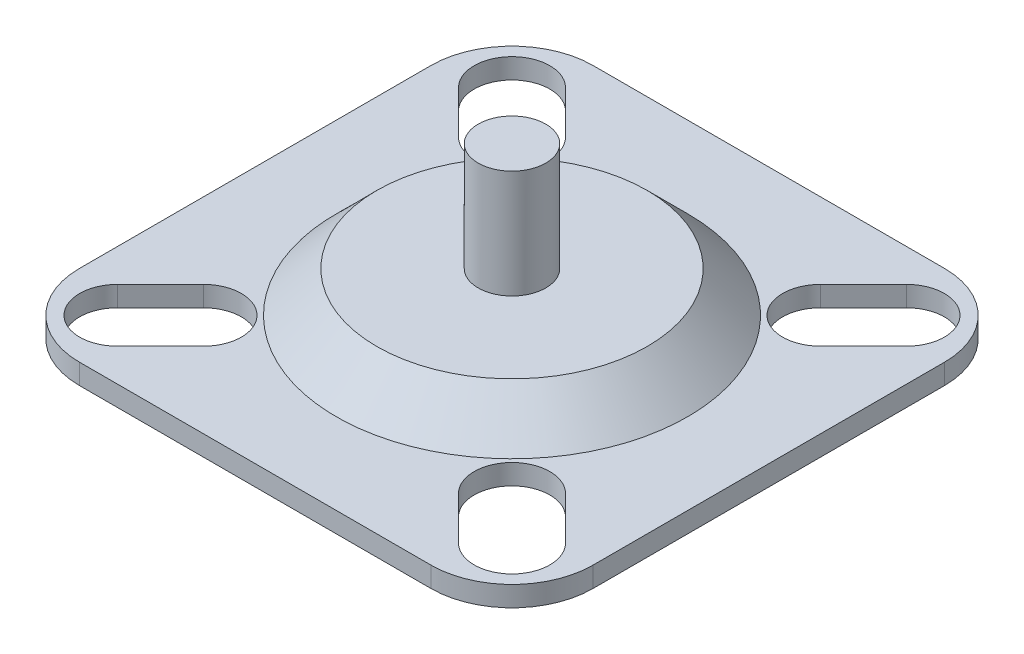
ISO-10303-21;
HEADER;
FILE_DESCRIPTION(('STEP AP214'),'2;1');
FILE_NAME('part.step','',(''),(''),'','','');
FILE_SCHEMA(('AUTOMOTIVE_DESIGN { 1 0 10303 214 1 1 1 1 }'));
ENDSEC;
DATA;
#1=APPLICATION_CONTEXT('core data for automotive mechanical design processes');
#2=APPLICATION_PROTOCOL_DEFINITION('international standard','automotive_design',2000,#1);
#3=PRODUCT_CONTEXT('',#1,'mechanical');
#4=PRODUCT('Part','Part','',(#3));
#5=PRODUCT_RELATED_PRODUCT_CATEGORY('part','',(#4));
#6=PRODUCT_DEFINITION_FORMATION('','',#4);
#7=PRODUCT_DEFINITION_CONTEXT('part definition',#1,'design');
#8=PRODUCT_DEFINITION('design','',#6,#7);
#9=PRODUCT_DEFINITION_SHAPE('','',#8);
#10=(LENGTH_UNIT() NAMED_UNIT(*) SI_UNIT(.MILLI.,.METRE.));
#11=(NAMED_UNIT(*) PLANE_ANGLE_UNIT() SI_UNIT($,.RADIAN.));
#12=(NAMED_UNIT(*) SI_UNIT($,.STERADIAN.) SOLID_ANGLE_UNIT());
#13=UNCERTAINTY_MEASURE_WITH_UNIT(LENGTH_MEASURE(1.E-05),#10,'distance_accuracy_value','');
#14=(GEOMETRIC_REPRESENTATION_CONTEXT(3) GLOBAL_UNCERTAINTY_ASSIGNED_CONTEXT((#13)) GLOBAL_UNIT_ASSIGNED_CONTEXT((#10,
#11,#12)) REPRESENTATION_CONTEXT('',''));
#15=CARTESIAN_POINT('',(0.,0.,0.));
#16=DIRECTION('',(0.,0.,1.));
#17=DIRECTION('',(1.,0.,0.));
#18=AXIS2_PLACEMENT_3D('',#15,#16,#17);
#19=CARTESIAN_POINT('',(0.,4.5,-10.));
#20=DIRECTION('',(0.,-1.,0.));
#21=DIRECTION('',(0.,0.,-1.));
#22=AXIS2_PLACEMENT_3D('',#19,#20,#21);
#23=PLANE('',#22);
#24=CARTESIAN_POINT('',(0.,4.50000000000001,0.));
#25=DIRECTION('',(0.,1.,0.));
#26=DIRECTION('',(0.,0.,1.));
#27=AXIS2_PLACEMENT_3D('',#24,#25,#26);
#28=CIRCLE('',#27,10.);
#29=CARTESIAN_POINT('',(0.,4.50000000000002,10.));
#30=VERTEX_POINT('',#29);
#31=EDGE_CURVE('E224',#30,#30,#28,.T.);
#32=ORIENTED_EDGE('',*,*,#31,.T.);
#33=EDGE_LOOP('',(#32));
#34=FACE_BOUND('',#33,.T.);
#35=CARTESIAN_POINT('',(0.,4.50000000000001,0.));
#36=DIRECTION('',(0.,-1.,0.));
#37=DIRECTION('',(0.,0.,-1.));
#38=AXIS2_PLACEMENT_3D('',#35,#36,#37);
#39=CIRCLE('',#38,2.5);
#40=CARTESIAN_POINT('',(0.,4.50000000000001,-2.50000000000001));
#41=VERTEX_POINT('',#40);
#42=EDGE_CURVE('E11',#41,#41,#39,.F.);
#43=ORIENTED_EDGE('',*,*,#42,.F.);
#44=EDGE_LOOP('',(#43));
#45=FACE_BOUND('',#44,.T.);
#46=ADVANCED_FACE('F33',(#34,#45),#23,.F.);
#47=CARTESIAN_POINT('',(-13.,0.,13.));
#48=DIRECTION('',(0.,-1.,0.));
#49=DIRECTION('',(0.,0.,-1.));
#50=AXIS2_PLACEMENT_3D('',#47,#48,#49);
#51=PLANE('',#50);
#52=CARTESIAN_POINT('',(0.,0.,0.));
#53=DIRECTION('',(0.,-1.,0.));
#54=DIRECTION('',(0.,0.,-1.));
#55=AXIS2_PLACEMENT_3D('',#52,#53,#54);
#56=CIRCLE('',#55,12.4142135623731);
#57=CARTESIAN_POINT('',(0.,0.,-12.4142135623731));
#58=VERTEX_POINT('',#57);
#59=EDGE_CURVE('E387',#58,#58,#56,.F.);
#60=ORIENTED_EDGE('',*,*,#59,.T.);
#61=EDGE_LOOP('',(#60));
#62=FACE_BOUND('',#61,.T.);
#63=DIRECTION('',(-0.707106781186547,0.,0.707106781186548));
#64=VECTOR('',#63,1.);
#65=CARTESIAN_POINT('',(-16.5708892449896,0.,12.6110912703474));
#66=LINE('',#65,#64);
#67=CARTESIAN_POINT('',(-13.3889087296501,0.,9.42911075500793));
#68=VERTEX_POINT('',#67);
#69=CARTESIAN_POINT('',(-16.5708892449896,0.,12.6110912703474));
#70=VERTEX_POINT('',#69);
#71=EDGE_CURVE('E203',#68,#70,#66,.T.);
#72=ORIENTED_EDGE('',*,*,#71,.T.);
#73=CARTESIAN_POINT('',(-14.5909902576673,0.,14.5909902576697));
#74=DIRECTION('',(0.,1.,0.));
#75=DIRECTION('',(0.,0.,1.));
#76=AXIS2_PLACEMENT_3D('',#73,#74,#75);
#77=CIRCLE('',#76,2.8);
#78=CARTESIAN_POINT('',(-12.6110912703449,0.,16.5708892449921));
#79=VERTEX_POINT('',#78);
#80=EDGE_CURVE('E56',#70,#79,#77,.T.);
#81=ORIENTED_EDGE('',*,*,#80,.T.);
#82=DIRECTION('',(0.707106781186547,0.,-0.707106781186547));
#83=VECTOR('',#82,1.);
#84=CARTESIAN_POINT('',(-12.6110912703449,0.,16.5708892449921));
#85=LINE('',#84,#83);
#86=CARTESIAN_POINT('',(-9.42911075500546,0.,13.3889087296526));
#87=VERTEX_POINT('',#86);
#88=EDGE_CURVE('E209',#79,#87,#85,.T.);
#89=ORIENTED_EDGE('',*,*,#88,.T.);
#90=CARTESIAN_POINT('',(-11.4090097423278,0.,11.4090097423303));
#91=DIRECTION('',(0.,1.,0.));
#92=DIRECTION('',(0.,0.,1.));
#93=AXIS2_PLACEMENT_3D('',#90,#91,#92);
#94=CIRCLE('',#93,2.8);
#95=EDGE_CURVE('E226',#87,#68,#94,.T.);
#96=ORIENTED_EDGE('',*,*,#95,.T.);
#97=EDGE_LOOP('',(#72,#81,#89,#96));
#98=FACE_BOUND('',#97,.T.);
#99=DIRECTION('',(0.707106781186548,0.,-0.707106781186547));
#100=VECTOR('',#99,1.);
#101=CARTESIAN_POINT('',(16.5708892449921,0.,-12.6110912703499));
#102=LINE('',#101,#100);
#103=CARTESIAN_POINT('',(13.3889087296526,0.,-9.42911075501042));
#104=VERTEX_POINT('',#103);
#105=CARTESIAN_POINT('',(16.5708892449921,0.,-12.6110912703499));
#106=VERTEX_POINT('',#105);
#107=EDGE_CURVE('E268',#104,#106,#102,.T.);
#108=ORIENTED_EDGE('',*,*,#107,.T.);
#109=CARTESIAN_POINT('',(14.5909902576697,0.,-14.5909902576722));
#110=DIRECTION('',(0.,1.,0.));
#111=DIRECTION('',(0.,0.,1.));
#112=AXIS2_PLACEMENT_3D('',#109,#110,#111);
#113=CIRCLE('',#112,2.8);
#114=CARTESIAN_POINT('',(12.6110912703474,0.,-16.5708892449945));
#115=VERTEX_POINT('',#114);
#116=EDGE_CURVE('E264',#106,#115,#113,.T.);
#117=ORIENTED_EDGE('',*,*,#116,.T.);
#118=DIRECTION('',(-0.707106781186547,0.,0.707106781186548));
#119=VECTOR('',#118,1.);
#120=CARTESIAN_POINT('',(12.6110912703474,0.,-16.5708892449945));
#121=LINE('',#120,#119);
#122=CARTESIAN_POINT('',(9.42911075500793,0.,-13.3889087296551));
#123=VERTEX_POINT('',#122);
#124=EDGE_CURVE('E278',#115,#123,#121,.T.);
#125=ORIENTED_EDGE('',*,*,#124,.T.);
#126=CARTESIAN_POINT('',(11.4090097423303,0.,-11.4090097423327));
#127=DIRECTION('',(0.,1.,0.));
#128=DIRECTION('',(0.,0.,1.));
#129=AXIS2_PLACEMENT_3D('',#126,#127,#128);
#130=CIRCLE('',#129,2.8);
#131=EDGE_CURVE('E281',#123,#104,#130,.T.);
#132=ORIENTED_EDGE('',*,*,#131,.T.);
#133=EDGE_LOOP('',(#108,#117,#125,#132));
#134=FACE_BOUND('',#133,.T.);
#135=CARTESIAN_POINT('',(-13.,0.,13.));
#136=DIRECTION('',(0.,1.,0.));
#137=DIRECTION('',(0.,0.,-1.));
#138=AXIS2_PLACEMENT_3D('',#135,#136,#137);
#139=CIRCLE('',#138,6.);
#140=CARTESIAN_POINT('',(-19.,0.,13.));
#141=VERTEX_POINT('',#140);
#142=CARTESIAN_POINT('',(-13.,0.,19.));
#143=VERTEX_POINT('',#142);
#144=EDGE_CURVE('E326',#141,#143,#139,.T.);
#145=ORIENTED_EDGE('',*,*,#144,.F.);
#146=DIRECTION('',(0.,0.,1.));
#147=VECTOR('',#146,1.);
#148=CARTESIAN_POINT('',(-19.,0.,13.));
#149=LINE('',#148,#147);
#150=CARTESIAN_POINT('',(-19.,0.,-13.));
#151=VERTEX_POINT('',#150);
#152=EDGE_CURVE('E331',#151,#141,#149,.T.);
#153=ORIENTED_EDGE('',*,*,#152,.F.);
#154=CARTESIAN_POINT('',(-13.,0.,-13.));
#155=DIRECTION('',(0.,1.,0.));
#156=DIRECTION('',(0.,0.,-1.));
#157=AXIS2_PLACEMENT_3D('',#154,#155,#156);
#158=CIRCLE('',#157,6.);
#159=CARTESIAN_POINT('',(-13.,0.,-19.));
#160=VERTEX_POINT('',#159);
#161=EDGE_CURVE('E358',#160,#151,#158,.T.);
#162=ORIENTED_EDGE('',*,*,#161,.F.);
#163=DIRECTION('',(-1.,0.,0.));
#164=VECTOR('',#163,1.);
#165=CARTESIAN_POINT('',(-13.,0.,-19.));
#166=LINE('',#165,#164);
#167=CARTESIAN_POINT('',(13.,0.,-19.));
#168=VERTEX_POINT('',#167);
#169=EDGE_CURVE('E356',#168,#160,#166,.T.);
#170=ORIENTED_EDGE('',*,*,#169,.F.);
#171=CARTESIAN_POINT('',(13.,0.,-13.));
#172=DIRECTION('',(0.,1.,0.));
#173=DIRECTION('',(0.,0.,-1.));
#174=AXIS2_PLACEMENT_3D('',#171,#172,#173);
#175=CIRCLE('',#174,6.);
#176=CARTESIAN_POINT('',(19.,0.,-13.));
#177=VERTEX_POINT('',#176);
#178=EDGE_CURVE('E354',#177,#168,#175,.T.);
#179=ORIENTED_EDGE('',*,*,#178,.F.);
#180=DIRECTION('',(0.,0.,-1.));
#181=VECTOR('',#180,1.);
#182=CARTESIAN_POINT('',(19.,0.,13.));
#183=LINE('',#182,#181);
#184=CARTESIAN_POINT('',(19.,0.,13.));
#185=VERTEX_POINT('',#184);
#186=EDGE_CURVE('E352',#185,#177,#183,.T.);
#187=ORIENTED_EDGE('',*,*,#186,.F.);
#188=CARTESIAN_POINT('',(13.,0.,13.));
#189=DIRECTION('',(0.,1.,0.));
#190=DIRECTION('',(0.,0.,1.));
#191=AXIS2_PLACEMENT_3D('',#188,#189,#190);
#192=CIRCLE('',#191,6.);
#193=CARTESIAN_POINT('',(13.,0.,19.));
#194=VERTEX_POINT('',#193);
#195=EDGE_CURVE('E350',#194,#185,#192,.T.);
#196=ORIENTED_EDGE('',*,*,#195,.F.);
#197=DIRECTION('',(1.,0.,0.));
#198=VECTOR('',#197,1.);
#199=CARTESIAN_POINT('',(-13.,0.,19.));
#200=LINE('',#199,#198);
#201=EDGE_CURVE('E348',#143,#194,#200,.T.);
#202=ORIENTED_EDGE('',*,*,#201,.F.);
#203=EDGE_LOOP('',(#145,#153,#162,#170,#179,#187,#196,#202));
#204=FACE_BOUND('',#203,.T.);
#205=DIRECTION('',(-0.707106781186548,0.,-0.707106781186547));
#206=VECTOR('',#205,1.);
#207=CARTESIAN_POINT('',(-12.6110912703474,0.,-16.5708892449921));
#208=LINE('',#207,#206);
#209=CARTESIAN_POINT('',(-9.42911075500793,0.,-13.3889087296526));
#210=VERTEX_POINT('',#209);
#211=CARTESIAN_POINT('',(-12.6110912703474,0.,-16.5708892449921));
#212=VERTEX_POINT('',#211);
#213=EDGE_CURVE('E299',#210,#212,#208,.T.);
#214=ORIENTED_EDGE('',*,*,#213,.T.);
#215=CARTESIAN_POINT('',(-14.5909902576697,0.,-14.5909902576697));
#216=DIRECTION('',(0.,1.,0.));
#217=DIRECTION('',(0.,0.,1.));
#218=AXIS2_PLACEMENT_3D('',#215,#216,#217);
#219=CIRCLE('',#218,2.8);
#220=CARTESIAN_POINT('',(-16.5708892449921,0.,-12.6110912703474));
#221=VERTEX_POINT('',#220);
#222=EDGE_CURVE('E295',#212,#221,#219,.T.);
#223=ORIENTED_EDGE('',*,*,#222,.T.);
#224=DIRECTION('',(0.707106781186548,0.,0.707106781186548));
#225=VECTOR('',#224,1.);
#226=CARTESIAN_POINT('',(-16.5708892449921,0.,-12.6110912703474));
#227=LINE('',#226,#225);
#228=CARTESIAN_POINT('',(-13.3889087296526,0.,-9.42911075500793));
#229=VERTEX_POINT('',#228);
#230=EDGE_CURVE('E309',#221,#229,#227,.T.);
#231=ORIENTED_EDGE('',*,*,#230,.T.);
#232=CARTESIAN_POINT('',(-11.4090097423303,0.,-11.4090097423303));
#233=DIRECTION('',(0.,1.,0.));
#234=DIRECTION('',(0.,0.,1.));
#235=AXIS2_PLACEMENT_3D('',#232,#233,#234);
#236=CIRCLE('',#235,2.8);
#237=EDGE_CURVE('E312',#229,#210,#236,.T.);
#238=ORIENTED_EDGE('',*,*,#237,.T.);
#239=EDGE_LOOP('',(#214,#223,#231,#238));
#240=FACE_BOUND('',#239,.T.);
#241=DIRECTION('',(0.707106781186548,0.,0.707106781186547));
#242=VECTOR('',#241,1.);
#243=CARTESIAN_POINT('',(12.6110912703499,0.,16.5708892449896));
#244=LINE('',#243,#242);
#245=CARTESIAN_POINT('',(9.42911075501042,0.,13.3889087296501));
#246=VERTEX_POINT('',#245);
#247=CARTESIAN_POINT('',(12.6110912703499,0.,16.5708892449896));
#248=VERTEX_POINT('',#247);
#249=EDGE_CURVE('E237',#246,#248,#244,.T.);
#250=ORIENTED_EDGE('',*,*,#249,.T.);
#251=CARTESIAN_POINT('',(14.5909902576722,0.,14.5909902576672));
#252=DIRECTION('',(0.,1.,0.));
#253=DIRECTION('',(0.,0.,1.));
#254=AXIS2_PLACEMENT_3D('',#251,#252,#253);
#255=CIRCLE('',#254,2.8);
#256=CARTESIAN_POINT('',(16.5708892449945,0.,12.6110912703449));
#257=VERTEX_POINT('',#256);
#258=EDGE_CURVE('E210',#248,#257,#255,.T.);
#259=ORIENTED_EDGE('',*,*,#258,.T.);
#260=DIRECTION('',(-0.707106781186547,0.,-0.707106781186548));
#261=VECTOR('',#260,1.);
#262=CARTESIAN_POINT('',(16.5708892449945,0.,12.6110912703449));
#263=LINE('',#262,#261);
#264=CARTESIAN_POINT('',(13.3889087296551,0.,9.42911075500545));
#265=VERTEX_POINT('',#264);
#266=EDGE_CURVE('E247',#257,#265,#263,.T.);
#267=ORIENTED_EDGE('',*,*,#266,.T.);
#268=CARTESIAN_POINT('',(11.4090097423328,0.,11.4090097423278));
#269=DIRECTION('',(0.,1.,0.));
#270=DIRECTION('',(0.,0.,1.));
#271=AXIS2_PLACEMENT_3D('',#268,#269,#270);
#272=CIRCLE('',#271,2.8);
#273=EDGE_CURVE('E250',#265,#246,#272,.T.);
#274=ORIENTED_EDGE('',*,*,#273,.T.);
#275=EDGE_LOOP('',(#250,#259,#267,#274));
#276=FACE_BOUND('',#275,.T.);
#277=ADVANCED_FACE('F421',(#62,#98,#134,#204,#240,#276),#51,.T.);
#278=CARTESIAN_POINT('',(-13.,1.5,13.));
#279=DIRECTION('',(0.,-1.,0.));
#280=DIRECTION('',(0.,0.,-1.));
#281=AXIS2_PLACEMENT_3D('',#278,#279,#280);
#282=PLANE('',#281);
#283=CARTESIAN_POINT('',(-14.5909902576673,1.5,14.5909902576697));
#284=DIRECTION('',(0.,1.,0.));
#285=DIRECTION('',(0.,0.,1.));
#286=AXIS2_PLACEMENT_3D('',#283,#284,#285);
#287=CIRCLE('',#286,2.8);
#288=CARTESIAN_POINT('',(-16.5708892449896,1.5,12.6110912703474));
#289=VERTEX_POINT('',#288);
#290=CARTESIAN_POINT('',(-12.6110912703449,1.5,16.5708892449921));
#291=VERTEX_POINT('',#290);
#292=EDGE_CURVE('E194',#289,#291,#287,.T.);
#293=ORIENTED_EDGE('',*,*,#292,.F.);
#294=DIRECTION('',(-0.707106781186547,0.,0.707106781186548));
#295=VECTOR('',#294,1.);
#296=CARTESIAN_POINT('',(-16.5708892449896,1.5,12.6110912703474));
#297=LINE('',#296,#295);
#298=CARTESIAN_POINT('',(-13.3889087296501,1.5,9.42911075500793));
#299=VERTEX_POINT('',#298);
#300=EDGE_CURVE('E218',#299,#289,#297,.T.);
#301=ORIENTED_EDGE('',*,*,#300,.F.);
#302=CARTESIAN_POINT('',(-11.4090097423278,1.5,11.4090097423303));
#303=DIRECTION('',(0.,1.,0.));
#304=DIRECTION('',(0.,0.,1.));
#305=AXIS2_PLACEMENT_3D('',#302,#303,#304);
#306=CIRCLE('',#305,2.8);
#307=CARTESIAN_POINT('',(-9.42911075500546,1.5,13.3889087296526));
#308=VERTEX_POINT('',#307);
#309=EDGE_CURVE('E216',#308,#299,#306,.T.);
#310=ORIENTED_EDGE('',*,*,#309,.F.);
#311=DIRECTION('',(0.707106781186547,0.,-0.707106781186547));
#312=VECTOR('',#311,1.);
#313=CARTESIAN_POINT('',(-12.6110912703449,1.5,16.5708892449921));
#314=LINE('',#313,#312);
#315=EDGE_CURVE('E202',#291,#308,#314,.T.);
#316=ORIENTED_EDGE('',*,*,#315,.F.);
#317=EDGE_LOOP('',(#293,#301,#310,#316));
#318=FACE_BOUND('',#317,.T.);
#319=CARTESIAN_POINT('',(14.5909902576697,1.5,-14.5909902576722));
#320=DIRECTION('',(0.,1.,0.));
#321=DIRECTION('',(0.,0.,1.));
#322=AXIS2_PLACEMENT_3D('',#319,#320,#321);
#323=CIRCLE('',#322,2.8);
#324=CARTESIAN_POINT('',(16.5708892449921,1.5,-12.6110912703499));
#325=VERTEX_POINT('',#324);
#326=CARTESIAN_POINT('',(12.6110912703474,1.5,-16.5708892449945));
#327=VERTEX_POINT('',#326);
#328=EDGE_CURVE('E265',#325,#327,#323,.T.);
#329=ORIENTED_EDGE('',*,*,#328,.F.);
#330=DIRECTION('',(0.707106781186548,0.,-0.707106781186547));
#331=VECTOR('',#330,1.);
#332=CARTESIAN_POINT('',(16.5708892449921,1.5,-12.6110912703499));
#333=LINE('',#332,#331);
#334=CARTESIAN_POINT('',(13.3889087296526,1.5,-9.42911075501042));
#335=VERTEX_POINT('',#334);
#336=EDGE_CURVE('E273',#335,#325,#333,.T.);
#337=ORIENTED_EDGE('',*,*,#336,.F.);
#338=CARTESIAN_POINT('',(11.4090097423303,1.5,-11.4090097423327));
#339=DIRECTION('',(0.,1.,0.));
#340=DIRECTION('',(0.,0.,1.));
#341=AXIS2_PLACEMENT_3D('',#338,#339,#340);
#342=CIRCLE('',#341,2.8);
#343=CARTESIAN_POINT('',(9.42911075500793,1.5,-13.3889087296551));
#344=VERTEX_POINT('',#343);
#345=EDGE_CURVE('E270',#344,#335,#342,.T.);
#346=ORIENTED_EDGE('',*,*,#345,.F.);
#347=DIRECTION('',(-0.707106781186547,0.,0.707106781186548));
#348=VECTOR('',#347,1.);
#349=CARTESIAN_POINT('',(12.6110912703474,1.5,-16.5708892449945));
#350=LINE('',#349,#348);
#351=EDGE_CURVE('E267',#327,#344,#350,.T.);
#352=ORIENTED_EDGE('',*,*,#351,.F.);
#353=EDGE_LOOP('',(#329,#337,#346,#352));
#354=FACE_BOUND('',#353,.T.);
#355=CARTESIAN_POINT('',(-13.,1.5,13.));
#356=DIRECTION('',(0.,1.,0.));
#357=DIRECTION('',(0.,0.,-1.));
#358=AXIS2_PLACEMENT_3D('',#355,#356,#357);
#359=CIRCLE('',#358,6.);
#360=CARTESIAN_POINT('',(-19.,1.5,13.));
#361=VERTEX_POINT('',#360);
#362=CARTESIAN_POINT('',(-13.,1.5,19.));
#363=VERTEX_POINT('',#362);
#364=EDGE_CURVE('E327',#361,#363,#359,.T.);
#365=ORIENTED_EDGE('',*,*,#364,.T.);
#366=DIRECTION('',(1.,0.,0.));
#367=VECTOR('',#366,1.);
#368=CARTESIAN_POINT('',(-13.,1.5,19.));
#369=LINE('',#368,#367);
#370=CARTESIAN_POINT('',(13.,1.5,19.));
#371=VERTEX_POINT('',#370);
#372=EDGE_CURVE('E330',#363,#371,#369,.T.);
#373=ORIENTED_EDGE('',*,*,#372,.T.);
#374=CARTESIAN_POINT('',(13.,1.5,13.));
#375=DIRECTION('',(0.,1.,0.));
#376=DIRECTION('',(0.,0.,1.));
#377=AXIS2_PLACEMENT_3D('',#374,#375,#376);
#378=CIRCLE('',#377,6.);
#379=CARTESIAN_POINT('',(19.,1.5,13.));
#380=VERTEX_POINT('',#379);
#381=EDGE_CURVE('E333',#371,#380,#378,.T.);
#382=ORIENTED_EDGE('',*,*,#381,.T.);
#383=DIRECTION('',(0.,0.,-1.));
#384=VECTOR('',#383,1.);
#385=CARTESIAN_POINT('',(19.,1.5,13.));
#386=LINE('',#385,#384);
#387=CARTESIAN_POINT('',(19.,1.5,-13.));
#388=VERTEX_POINT('',#387);
#389=EDGE_CURVE('E335',#380,#388,#386,.T.);
#390=ORIENTED_EDGE('',*,*,#389,.T.);
#391=CARTESIAN_POINT('',(13.,1.5,-13.));
#392=DIRECTION('',(0.,1.,0.));
#393=DIRECTION('',(0.,0.,-1.));
#394=AXIS2_PLACEMENT_3D('',#391,#392,#393);
#395=CIRCLE('',#394,6.);
#396=CARTESIAN_POINT('',(13.,1.5,-19.));
#397=VERTEX_POINT('',#396);
#398=EDGE_CURVE('E337',#388,#397,#395,.T.);
#399=ORIENTED_EDGE('',*,*,#398,.T.);
#400=DIRECTION('',(-1.,0.,0.));
#401=VECTOR('',#400,1.);
#402=CARTESIAN_POINT('',(-13.,1.5,-19.));
#403=LINE('',#402,#401);
#404=CARTESIAN_POINT('',(-13.,1.5,-19.));
#405=VERTEX_POINT('',#404);
#406=EDGE_CURVE('E339',#397,#405,#403,.T.);
#407=ORIENTED_EDGE('',*,*,#406,.T.);
#408=CARTESIAN_POINT('',(-13.,1.5,-13.));
#409=DIRECTION('',(0.,1.,0.));
#410=DIRECTION('',(0.,0.,-1.));
#411=AXIS2_PLACEMENT_3D('',#408,#409,#410);
#412=CIRCLE('',#411,6.);
#413=CARTESIAN_POINT('',(-19.,1.5,-13.));
#414=VERTEX_POINT('',#413);
#415=EDGE_CURVE('E341',#405,#414,#412,.T.);
#416=ORIENTED_EDGE('',*,*,#415,.T.);
#417=DIRECTION('',(0.,0.,1.));
#418=VECTOR('',#417,1.);
#419=CARTESIAN_POINT('',(-19.,1.5,13.));
#420=LINE('',#419,#418);
#421=EDGE_CURVE('E343',#414,#361,#420,.T.);
#422=ORIENTED_EDGE('',*,*,#421,.T.);
#423=EDGE_LOOP('',(#365,#373,#382,#390,#399,#407,#416,#422));
#424=FACE_BOUND('',#423,.T.);
#425=CARTESIAN_POINT('',(-14.5909902576697,1.5,-14.5909902576697));
#426=DIRECTION('',(0.,1.,0.));
#427=DIRECTION('',(0.,0.,1.));
#428=AXIS2_PLACEMENT_3D('',#425,#426,#427);
#429=CIRCLE('',#428,2.8);
#430=CARTESIAN_POINT('',(-12.6110912703474,1.5,-16.5708892449921));
#431=VERTEX_POINT('',#430);
#432=CARTESIAN_POINT('',(-16.5708892449921,1.5,-12.6110912703474));
#433=VERTEX_POINT('',#432);
#434=EDGE_CURVE('E296',#431,#433,#429,.T.);
#435=ORIENTED_EDGE('',*,*,#434,.F.);
#436=DIRECTION('',(-0.707106781186548,0.,-0.707106781186547));
#437=VECTOR('',#436,1.);
#438=CARTESIAN_POINT('',(-12.6110912703474,1.5,-16.5708892449921));
#439=LINE('',#438,#437);
#440=CARTESIAN_POINT('',(-9.42911075500793,1.5,-13.3889087296526));
#441=VERTEX_POINT('',#440);
#442=EDGE_CURVE('E304',#441,#431,#439,.T.);
#443=ORIENTED_EDGE('',*,*,#442,.F.);
#444=CARTESIAN_POINT('',(-11.4090097423303,1.5,-11.4090097423303));
#445=DIRECTION('',(0.,1.,0.));
#446=DIRECTION('',(0.,0.,1.));
#447=AXIS2_PLACEMENT_3D('',#444,#445,#446);
#448=CIRCLE('',#447,2.8);
#449=CARTESIAN_POINT('',(-13.3889087296526,1.5,-9.42911075500793));
#450=VERTEX_POINT('',#449);
#451=EDGE_CURVE('E301',#450,#441,#448,.T.);
#452=ORIENTED_EDGE('',*,*,#451,.F.);
#453=DIRECTION('',(0.707106781186548,0.,0.707106781186548));
#454=VECTOR('',#453,1.);
#455=CARTESIAN_POINT('',(-16.5708892449921,1.5,-12.6110912703474));
#456=LINE('',#455,#454);
#457=EDGE_CURVE('E298',#433,#450,#456,.T.);
#458=ORIENTED_EDGE('',*,*,#457,.F.);
#459=EDGE_LOOP('',(#435,#443,#452,#458));
#460=FACE_BOUND('',#459,.T.);
#461=CARTESIAN_POINT('',(14.5909902576722,1.5,14.5909902576672));
#462=DIRECTION('',(0.,1.,0.));
#463=DIRECTION('',(0.,0.,1.));
#464=AXIS2_PLACEMENT_3D('',#461,#462,#463);
#465=CIRCLE('',#464,2.8);
#466=CARTESIAN_POINT('',(12.6110912703499,1.5,16.5708892449896));
#467=VERTEX_POINT('',#466);
#468=CARTESIAN_POINT('',(16.5708892449945,1.5,12.6110912703449));
#469=VERTEX_POINT('',#468);
#470=EDGE_CURVE('E234',#467,#469,#465,.T.);
#471=ORIENTED_EDGE('',*,*,#470,.F.);
#472=DIRECTION('',(0.707106781186548,0.,0.707106781186547));
#473=VECTOR('',#472,1.);
#474=CARTESIAN_POINT('',(12.6110912703499,1.5,16.5708892449896));
#475=LINE('',#474,#473);
#476=CARTESIAN_POINT('',(9.42911075501042,1.5,13.3889087296501));
#477=VERTEX_POINT('',#476);
#478=EDGE_CURVE('E242',#477,#467,#475,.T.);
#479=ORIENTED_EDGE('',*,*,#478,.F.);
#480=CARTESIAN_POINT('',(11.4090097423328,1.5,11.4090097423278));
#481=DIRECTION('',(0.,1.,0.));
#482=DIRECTION('',(0.,0.,1.));
#483=AXIS2_PLACEMENT_3D('',#480,#481,#482);
#484=CIRCLE('',#483,2.8);
#485=CARTESIAN_POINT('',(13.3889087296551,1.5,9.42911075500545));
#486=VERTEX_POINT('',#485);
#487=EDGE_CURVE('E239',#486,#477,#484,.T.);
#488=ORIENTED_EDGE('',*,*,#487,.F.);
#489=DIRECTION('',(-0.707106781186547,0.,-0.707106781186548));
#490=VECTOR('',#489,1.);
#491=CARTESIAN_POINT('',(16.5708892449945,1.5,12.6110912703449));
#492=LINE('',#491,#490);
#493=EDGE_CURVE('E236',#469,#486,#492,.T.);
#494=ORIENTED_EDGE('',*,*,#493,.F.);
#495=EDGE_LOOP('',(#471,#479,#488,#494));
#496=FACE_BOUND('',#495,.T.);
#497=CARTESIAN_POINT('',(0.,1.5,0.));
#498=DIRECTION('',(0.,-1.,0.));
#499=DIRECTION('',(0.,0.,-1.));
#500=AXIS2_PLACEMENT_3D('',#497,#498,#499);
#501=CIRCLE('',#500,13.);
#502=CARTESIAN_POINT('',(0.,1.5,-13.));
#503=VERTEX_POINT('',#502);
#504=EDGE_CURVE('E384',#503,#503,#501,.F.);
#505=ORIENTED_EDGE('',*,*,#504,.F.);
#506=EDGE_LOOP('',(#505));
#507=FACE_BOUND('',#506,.T.);
#508=ADVANCED_FACE('F214',(#318,#354,#424,#460,#496,#507),#282,.F.);
#509=CARTESIAN_POINT('',(-13.,1.5,13.));
#510=DIRECTION('',(0.,-1.,0.));
#511=DIRECTION('',(0.,0.,-1.));
#512=AXIS2_PLACEMENT_3D('',#509,#510,#511);
#513=CYLINDRICAL_SURFACE('',#512,6.);
#514=ORIENTED_EDGE('',*,*,#144,.T.);
#515=DIRECTION('',(0.,-1.,0.));
#516=VECTOR('',#515,1.);
#517=CARTESIAN_POINT('',(-13.,1.5,19.));
#518=LINE('',#517,#516);
#519=EDGE_CURVE('E381',#363,#143,#518,.T.);
#520=ORIENTED_EDGE('',*,*,#519,.F.);
#521=ORIENTED_EDGE('',*,*,#364,.F.);
#522=DIRECTION('',(0.,-1.,0.));
#523=VECTOR('',#522,1.);
#524=CARTESIAN_POINT('',(-19.,1.5,13.));
#525=LINE('',#524,#523);
#526=EDGE_CURVE('E345',#361,#141,#525,.T.);
#527=ORIENTED_EDGE('',*,*,#526,.T.);
#528=EDGE_LOOP('',(#514,#520,#521,#527));
#529=FACE_BOUND('',#528,.T.);
#530=ADVANCED_FACE('F491',(#529),#513,.T.);
#531=CARTESIAN_POINT('',(-13.,1.5,19.));
#532=DIRECTION('',(0.,0.,-1.));
#533=DIRECTION('',(-1.,0.,0.));
#534=AXIS2_PLACEMENT_3D('',#531,#532,#533);
#535=PLANE('',#534);
#536=ORIENTED_EDGE('',*,*,#201,.T.);
#537=DIRECTION('',(0.,-1.,0.));
#538=VECTOR('',#537,1.);
#539=CARTESIAN_POINT('',(13.,1.5,19.));
#540=LINE('',#539,#538);
#541=EDGE_CURVE('E378',#371,#194,#540,.T.);
#542=ORIENTED_EDGE('',*,*,#541,.F.);
#543=ORIENTED_EDGE('',*,*,#372,.F.);
#544=ORIENTED_EDGE('',*,*,#519,.T.);
#545=EDGE_LOOP('',(#536,#542,#543,#544));
#546=FACE_BOUND('',#545,.T.);
#547=ADVANCED_FACE('F515',(#546),#535,.F.);
#548=CARTESIAN_POINT('',(13.,1.5,13.));
#549=DIRECTION('',(0.,-1.,0.));
#550=DIRECTION('',(0.,0.,-1.));
#551=AXIS2_PLACEMENT_3D('',#548,#549,#550);
#552=CYLINDRICAL_SURFACE('',#551,6.);
#553=ORIENTED_EDGE('',*,*,#195,.T.);
#554=DIRECTION('',(0.,-1.,0.));
#555=VECTOR('',#554,1.);
#556=CARTESIAN_POINT('',(19.,1.5,13.));
#557=LINE('',#556,#555);
#558=EDGE_CURVE('E375',#380,#185,#557,.T.);
#559=ORIENTED_EDGE('',*,*,#558,.F.);
#560=ORIENTED_EDGE('',*,*,#381,.F.);
#561=ORIENTED_EDGE('',*,*,#541,.T.);
#562=EDGE_LOOP('',(#553,#559,#560,#561));
#563=FACE_BOUND('',#562,.T.);
#564=ADVANCED_FACE('F511',(#563),#552,.T.);
#565=CARTESIAN_POINT('',(19.,1.5,13.));
#566=DIRECTION('',(-1.,0.,0.));
#567=DIRECTION('',(0.,0.,1.));
#568=AXIS2_PLACEMENT_3D('',#565,#566,#567);
#569=PLANE('',#568);
#570=ORIENTED_EDGE('',*,*,#186,.T.);
#571=DIRECTION('',(0.,-1.,0.));
#572=VECTOR('',#571,1.);
#573=CARTESIAN_POINT('',(19.,1.5,-13.));
#574=LINE('',#573,#572);
#575=EDGE_CURVE('E372',#388,#177,#574,.T.);
#576=ORIENTED_EDGE('',*,*,#575,.F.);
#577=ORIENTED_EDGE('',*,*,#389,.F.);
#578=ORIENTED_EDGE('',*,*,#558,.T.);
#579=EDGE_LOOP('',(#570,#576,#577,#578));
#580=FACE_BOUND('',#579,.T.);
#581=ADVANCED_FACE('F507',(#580),#569,.F.);
#582=CARTESIAN_POINT('',(13.,1.5,-13.));
#583=DIRECTION('',(0.,-1.,0.));
#584=DIRECTION('',(0.,0.,-1.));
#585=AXIS2_PLACEMENT_3D('',#582,#583,#584);
#586=CYLINDRICAL_SURFACE('',#585,6.);
#587=ORIENTED_EDGE('',*,*,#178,.T.);
#588=DIRECTION('',(0.,-1.,0.));
#589=VECTOR('',#588,1.);
#590=CARTESIAN_POINT('',(13.,1.5,-19.));
#591=LINE('',#590,#589);
#592=EDGE_CURVE('E369',#397,#168,#591,.T.);
#593=ORIENTED_EDGE('',*,*,#592,.F.);
#594=ORIENTED_EDGE('',*,*,#398,.F.);
#595=ORIENTED_EDGE('',*,*,#575,.T.);
#596=EDGE_LOOP('',(#587,#593,#594,#595));
#597=FACE_BOUND('',#596,.T.);
#598=ADVANCED_FACE('F503',(#597),#586,.T.);
#599=CARTESIAN_POINT('',(-13.,1.5,-19.));
#600=DIRECTION('',(0.,0.,1.));
#601=DIRECTION('',(1.,0.,0.));
#602=AXIS2_PLACEMENT_3D('',#599,#600,#601);
#603=PLANE('',#602);
#604=ORIENTED_EDGE('',*,*,#169,.T.);
#605=DIRECTION('',(0.,-1.,0.));
#606=VECTOR('',#605,1.);
#607=CARTESIAN_POINT('',(-13.,1.5,-19.));
#608=LINE('',#607,#606);
#609=EDGE_CURVE('E366',#405,#160,#608,.T.);
#610=ORIENTED_EDGE('',*,*,#609,.F.);
#611=ORIENTED_EDGE('',*,*,#406,.F.);
#612=ORIENTED_EDGE('',*,*,#592,.T.);
#613=EDGE_LOOP('',(#604,#610,#611,#612));
#614=FACE_BOUND('',#613,.T.);
#615=ADVANCED_FACE('F499',(#614),#603,.F.);
#616=CARTESIAN_POINT('',(-13.,1.5,-13.));
#617=DIRECTION('',(0.,-1.,0.));
#618=DIRECTION('',(0.,0.,-1.));
#619=AXIS2_PLACEMENT_3D('',#616,#617,#618);
#620=CYLINDRICAL_SURFACE('',#619,6.);
#621=ORIENTED_EDGE('',*,*,#161,.T.);
#622=DIRECTION('',(0.,-1.,0.));
#623=VECTOR('',#622,1.);
#624=CARTESIAN_POINT('',(-19.,1.5,-13.));
#625=LINE('',#624,#623);
#626=EDGE_CURVE('E363',#414,#151,#625,.T.);
#627=ORIENTED_EDGE('',*,*,#626,.F.);
#628=ORIENTED_EDGE('',*,*,#415,.F.);
#629=ORIENTED_EDGE('',*,*,#609,.T.);
#630=EDGE_LOOP('',(#621,#627,#628,#629));
#631=FACE_BOUND('',#630,.T.);
#632=ADVANCED_FACE('F495',(#631),#620,.T.);
#633=CARTESIAN_POINT('',(-19.,1.5,13.));
#634=DIRECTION('',(1.,0.,0.));
#635=DIRECTION('',(0.,0.,-1.));
#636=AXIS2_PLACEMENT_3D('',#633,#634,#635);
#637=PLANE('',#636);
#638=ORIENTED_EDGE('',*,*,#152,.T.);
#639=ORIENTED_EDGE('',*,*,#526,.F.);
#640=ORIENTED_EDGE('',*,*,#421,.F.);
#641=ORIENTED_EDGE('',*,*,#626,.T.);
#642=EDGE_LOOP('',(#638,#639,#640,#641));
#643=FACE_BOUND('',#642,.T.);
#644=ADVANCED_FACE('F488',(#643),#637,.F.);
#645=CARTESIAN_POINT('',(-14.5909902576697,1.5,-14.5909902576697));
#646=DIRECTION('',(0.,-1.,0.));
#647=DIRECTION('',(0.,0.,-1.));
#648=AXIS2_PLACEMENT_3D('',#645,#646,#647);
#649=CYLINDRICAL_SURFACE('',#648,2.8);
#650=ORIENTED_EDGE('',*,*,#222,.F.);
#651=DIRECTION('',(0.,-1.,0.));
#652=VECTOR('',#651,1.);
#653=CARTESIAN_POINT('',(-12.6110912703474,1.5,-16.5708892449921));
#654=LINE('',#653,#652);
#655=EDGE_CURVE('E306',#431,#212,#654,.T.);
#656=ORIENTED_EDGE('',*,*,#655,.F.);
#657=ORIENTED_EDGE('',*,*,#434,.T.);
#658=DIRECTION('',(0.,-1.,0.));
#659=VECTOR('',#658,1.);
#660=CARTESIAN_POINT('',(-16.5708892449921,1.5,-12.6110912703474));
#661=LINE('',#660,#659);
#662=EDGE_CURVE('E323',#433,#221,#661,.T.);
#663=ORIENTED_EDGE('',*,*,#662,.T.);
#664=EDGE_LOOP('',(#650,#656,#657,#663));
#665=FACE_BOUND('',#664,.T.);
#666=ADVANCED_FACE('F484',(#665),#649,.F.);
#667=CARTESIAN_POINT('',(-16.5708892449921,1.5,-12.6110912703474));
#668=DIRECTION('',(0.707106781186547,0.,-0.707106781186547));
#669=DIRECTION('',(-0.707106781186548,0.,-0.707106781186548));
#670=AXIS2_PLACEMENT_3D('',#667,#668,#669);
#671=PLANE('',#670);
#672=ORIENTED_EDGE('',*,*,#230,.F.);
#673=ORIENTED_EDGE('',*,*,#662,.F.);
#674=ORIENTED_EDGE('',*,*,#457,.T.);
#675=DIRECTION('',(0.,-1.,0.));
#676=VECTOR('',#675,1.);
#677=CARTESIAN_POINT('',(-13.3889087296526,1.5,-9.42911075500793));
#678=LINE('',#677,#676);
#679=EDGE_CURVE('E321',#450,#229,#678,.T.);
#680=ORIENTED_EDGE('',*,*,#679,.T.);
#681=EDGE_LOOP('',(#672,#673,#674,#680));
#682=FACE_BOUND('',#681,.T.);
#683=ADVANCED_FACE('F480',(#682),#671,.T.);
#684=CARTESIAN_POINT('',(-11.4090097423303,1.5,-11.4090097423303));
#685=DIRECTION('',(0.,-1.,0.));
#686=DIRECTION('',(0.,0.,-1.));
#687=AXIS2_PLACEMENT_3D('',#684,#685,#686);
#688=CYLINDRICAL_SURFACE('',#687,2.8);
#689=ORIENTED_EDGE('',*,*,#237,.F.);
#690=ORIENTED_EDGE('',*,*,#679,.F.);
#691=ORIENTED_EDGE('',*,*,#451,.T.);
#692=DIRECTION('',(0.,-1.,0.));
#693=VECTOR('',#692,1.);
#694=CARTESIAN_POINT('',(-9.42911075500793,1.5,-13.3889087296526));
#695=LINE('',#694,#693);
#696=EDGE_CURVE('E319',#441,#210,#695,.T.);
#697=ORIENTED_EDGE('',*,*,#696,.T.);
#698=EDGE_LOOP('',(#689,#690,#691,#697));
#699=FACE_BOUND('',#698,.T.);
#700=ADVANCED_FACE('F476',(#699),#688,.F.);
#701=CARTESIAN_POINT('',(-12.6110912703474,1.5,-16.5708892449921));
#702=DIRECTION('',(-0.707106781186547,0.,0.707106781186548));
#703=DIRECTION('',(0.707106781186548,0.,0.707106781186547));
#704=AXIS2_PLACEMENT_3D('',#701,#702,#703);
#705=PLANE('',#704);
#706=ORIENTED_EDGE('',*,*,#213,.F.);
#707=ORIENTED_EDGE('',*,*,#696,.F.);
#708=ORIENTED_EDGE('',*,*,#442,.T.);
#709=ORIENTED_EDGE('',*,*,#655,.T.);
#710=EDGE_LOOP('',(#706,#707,#708,#709));
#711=FACE_BOUND('',#710,.T.);
#712=ADVANCED_FACE('F472',(#711),#705,.T.);
#713=CARTESIAN_POINT('',(14.5909902576697,1.5,-14.5909902576722));
#714=DIRECTION('',(0.,-1.,0.));
#715=DIRECTION('',(0.,0.,-1.));
#716=AXIS2_PLACEMENT_3D('',#713,#714,#715);
#717=CYLINDRICAL_SURFACE('',#716,2.8);
#718=ORIENTED_EDGE('',*,*,#116,.F.);
#719=DIRECTION('',(0.,-1.,0.));
#720=VECTOR('',#719,1.);
#721=CARTESIAN_POINT('',(16.5708892449921,1.5,-12.6110912703499));
#722=LINE('',#721,#720);
#723=EDGE_CURVE('E275',#325,#106,#722,.T.);
#724=ORIENTED_EDGE('',*,*,#723,.F.);
#725=ORIENTED_EDGE('',*,*,#328,.T.);
#726=DIRECTION('',(0.,-1.,0.));
#727=VECTOR('',#726,1.);
#728=CARTESIAN_POINT('',(12.6110912703474,1.5,-16.5708892449945));
#729=LINE('',#728,#727);
#730=EDGE_CURVE('E292',#327,#115,#729,.T.);
#731=ORIENTED_EDGE('',*,*,#730,.T.);
#732=EDGE_LOOP('',(#718,#724,#725,#731));
#733=FACE_BOUND('',#732,.T.);
#734=ADVANCED_FACE('F468',(#733),#717,.F.);
#735=CARTESIAN_POINT('',(12.6110912703474,1.5,-16.5708892449945));
#736=DIRECTION('',(0.707106781186548,0.,0.707106781186547));
#737=DIRECTION('',(0.707106781186547,0.,-0.707106781186548));
#738=AXIS2_PLACEMENT_3D('',#735,#736,#737);
#739=PLANE('',#738);
#740=ORIENTED_EDGE('',*,*,#124,.F.);
#741=ORIENTED_EDGE('',*,*,#730,.F.);
#742=ORIENTED_EDGE('',*,*,#351,.T.);
#743=DIRECTION('',(0.,-1.,0.));
#744=VECTOR('',#743,1.);
#745=CARTESIAN_POINT('',(9.42911075500793,1.5,-13.3889087296551));
#746=LINE('',#745,#744);
#747=EDGE_CURVE('E290',#344,#123,#746,.T.);
#748=ORIENTED_EDGE('',*,*,#747,.T.);
#749=EDGE_LOOP('',(#740,#741,#742,#748));
#750=FACE_BOUND('',#749,.T.);
#751=ADVANCED_FACE('F464',(#750),#739,.T.);
#752=CARTESIAN_POINT('',(11.4090097423303,1.5,-11.4090097423327));
#753=DIRECTION('',(0.,-1.,0.));
#754=DIRECTION('',(0.,0.,-1.));
#755=AXIS2_PLACEMENT_3D('',#752,#753,#754);
#756=CYLINDRICAL_SURFACE('',#755,2.8);
#757=ORIENTED_EDGE('',*,*,#131,.F.);
#758=ORIENTED_EDGE('',*,*,#747,.F.);
#759=ORIENTED_EDGE('',*,*,#345,.T.);
#760=DIRECTION('',(0.,-1.,0.));
#761=VECTOR('',#760,1.);
#762=CARTESIAN_POINT('',(13.3889087296526,1.5,-9.42911075501042));
#763=LINE('',#762,#761);
#764=EDGE_CURVE('E288',#335,#104,#763,.T.);
#765=ORIENTED_EDGE('',*,*,#764,.T.);
#766=EDGE_LOOP('',(#757,#758,#759,#765));
#767=FACE_BOUND('',#766,.T.);
#768=ADVANCED_FACE('F460',(#767),#756,.F.);
#769=CARTESIAN_POINT('',(16.5708892449921,1.5,-12.6110912703499));
#770=DIRECTION('',(-0.707106781186547,0.,-0.707106781186548));
#771=DIRECTION('',(-0.707106781186548,0.,0.707106781186547));
#772=AXIS2_PLACEMENT_3D('',#769,#770,#771);
#773=PLANE('',#772);
#774=ORIENTED_EDGE('',*,*,#107,.F.);
#775=ORIENTED_EDGE('',*,*,#764,.F.);
#776=ORIENTED_EDGE('',*,*,#336,.T.);
#777=ORIENTED_EDGE('',*,*,#723,.T.);
#778=EDGE_LOOP('',(#774,#775,#776,#777));
#779=FACE_BOUND('',#778,.T.);
#780=ADVANCED_FACE('F456',(#779),#773,.T.);
#781=CARTESIAN_POINT('',(14.5909902576722,1.5,14.5909902576672));
#782=DIRECTION('',(0.,-1.,0.));
#783=DIRECTION('',(0.,0.,-1.));
#784=AXIS2_PLACEMENT_3D('',#781,#782,#783);
#785=CYLINDRICAL_SURFACE('',#784,2.8);
#786=ORIENTED_EDGE('',*,*,#258,.F.);
#787=DIRECTION('',(0.,-1.,0.));
#788=VECTOR('',#787,1.);
#789=CARTESIAN_POINT('',(12.6110912703499,1.5,16.5708892449896));
#790=LINE('',#789,#788);
#791=EDGE_CURVE('E244',#467,#248,#790,.T.);
#792=ORIENTED_EDGE('',*,*,#791,.F.);
#793=ORIENTED_EDGE('',*,*,#470,.T.);
#794=DIRECTION('',(0.,-1.,0.));
#795=VECTOR('',#794,1.);
#796=CARTESIAN_POINT('',(16.5708892449945,1.5,12.6110912703449));
#797=LINE('',#796,#795);
#798=EDGE_CURVE('E261',#469,#257,#797,.T.);
#799=ORIENTED_EDGE('',*,*,#798,.T.);
#800=EDGE_LOOP('',(#786,#792,#793,#799));
#801=FACE_BOUND('',#800,.T.);
#802=ADVANCED_FACE('F452',(#801),#785,.F.);
#803=CARTESIAN_POINT('',(16.5708892449945,1.5,12.6110912703449));
#804=DIRECTION('',(-0.707106781186548,0.,0.707106781186547));
#805=DIRECTION('',(0.707106781186547,0.,0.707106781186548));
#806=AXIS2_PLACEMENT_3D('',#803,#804,#805);
#807=PLANE('',#806);
#808=ORIENTED_EDGE('',*,*,#266,.F.);
#809=ORIENTED_EDGE('',*,*,#798,.F.);
#810=ORIENTED_EDGE('',*,*,#493,.T.);
#811=DIRECTION('',(0.,-1.,0.));
#812=VECTOR('',#811,1.);
#813=CARTESIAN_POINT('',(13.3889087296551,1.5,9.42911075500545));
#814=LINE('',#813,#812);
#815=EDGE_CURVE('E259',#486,#265,#814,.T.);
#816=ORIENTED_EDGE('',*,*,#815,.T.);
#817=EDGE_LOOP('',(#808,#809,#810,#816));
#818=FACE_BOUND('',#817,.T.);
#819=ADVANCED_FACE('F448',(#818),#807,.T.);
#820=CARTESIAN_POINT('',(11.4090097423328,1.5,11.4090097423278));
#821=DIRECTION('',(0.,-1.,0.));
#822=DIRECTION('',(0.,0.,-1.));
#823=AXIS2_PLACEMENT_3D('',#820,#821,#822);
#824=CYLINDRICAL_SURFACE('',#823,2.8);
#825=ORIENTED_EDGE('',*,*,#273,.F.);
#826=ORIENTED_EDGE('',*,*,#815,.F.);
#827=ORIENTED_EDGE('',*,*,#487,.T.);
#828=DIRECTION('',(0.,-1.,0.));
#829=VECTOR('',#828,1.);
#830=CARTESIAN_POINT('',(9.42911075501042,1.5,13.3889087296501));
#831=LINE('',#830,#829);
#832=EDGE_CURVE('E257',#477,#246,#831,.T.);
#833=ORIENTED_EDGE('',*,*,#832,.T.);
#834=EDGE_LOOP('',(#825,#826,#827,#833));
#835=FACE_BOUND('',#834,.T.);
#836=ADVANCED_FACE('F444',(#835),#824,.F.);
#837=CARTESIAN_POINT('',(12.6110912703499,1.5,16.5708892449896));
#838=DIRECTION('',(0.707106781186547,0.,-0.707106781186548));
#839=DIRECTION('',(-0.707106781186548,0.,-0.707106781186547));
#840=AXIS2_PLACEMENT_3D('',#837,#838,#839);
#841=PLANE('',#840);
#842=ORIENTED_EDGE('',*,*,#249,.F.);
#843=ORIENTED_EDGE('',*,*,#832,.F.);
#844=ORIENTED_EDGE('',*,*,#478,.T.);
#845=ORIENTED_EDGE('',*,*,#791,.T.);
#846=EDGE_LOOP('',(#842,#843,#844,#845));
#847=FACE_BOUND('',#846,.T.);
#848=ADVANCED_FACE('F441',(#847),#841,.T.);
#849=CARTESIAN_POINT('',(-14.5909902576673,1.5,14.5909902576697));
#850=DIRECTION('',(0.,-1.,0.));
#851=DIRECTION('',(0.,0.,-1.));
#852=AXIS2_PLACEMENT_3D('',#849,#850,#851);
#853=CYLINDRICAL_SURFACE('',#852,2.8);
#854=ORIENTED_EDGE('',*,*,#80,.F.);
#855=DIRECTION('',(0.,-1.,0.));
#856=VECTOR('',#855,1.);
#857=CARTESIAN_POINT('',(-16.5708892449896,1.5,12.6110912703474));
#858=LINE('',#857,#856);
#859=EDGE_CURVE('E198',#289,#70,#858,.T.);
#860=ORIENTED_EDGE('',*,*,#859,.F.);
#861=ORIENTED_EDGE('',*,*,#292,.T.);
#862=DIRECTION('',(0.,-1.,0.));
#863=VECTOR('',#862,1.);
#864=CARTESIAN_POINT('',(-12.6110912703449,1.5,16.5708892449921));
#865=LINE('',#864,#863);
#866=EDGE_CURVE('E197',#291,#79,#865,.T.);
#867=ORIENTED_EDGE('',*,*,#866,.T.);
#868=EDGE_LOOP('',(#854,#860,#861,#867));
#869=FACE_BOUND('',#868,.T.);
#870=ADVANCED_FACE('F196',(#869),#853,.F.);
#871=CARTESIAN_POINT('',(-12.6110912703449,1.5,16.5708892449921));
#872=DIRECTION('',(-0.707106781186548,0.,-0.707106781186548));
#873=DIRECTION('',(-0.707106781186548,0.,0.707106781186548));
#874=AXIS2_PLACEMENT_3D('',#871,#872,#873);
#875=PLANE('',#874);
#876=ORIENTED_EDGE('',*,*,#88,.F.);
#877=ORIENTED_EDGE('',*,*,#866,.F.);
#878=ORIENTED_EDGE('',*,*,#315,.T.);
#879=DIRECTION('',(0.,-1.,0.));
#880=VECTOR('',#879,1.);
#881=CARTESIAN_POINT('',(-9.42911075500546,1.5,13.3889087296526));
#882=LINE('',#881,#880);
#883=EDGE_CURVE('E211',#308,#87,#882,.T.);
#884=ORIENTED_EDGE('',*,*,#883,.T.);
#885=EDGE_LOOP('',(#876,#877,#878,#884));
#886=FACE_BOUND('',#885,.T.);
#887=ADVANCED_FACE('F206',(#886),#875,.T.);
#888=CARTESIAN_POINT('',(-11.4090097423278,1.5,11.4090097423303));
#889=DIRECTION('',(0.,-1.,0.));
#890=DIRECTION('',(0.,0.,-1.));
#891=AXIS2_PLACEMENT_3D('',#888,#889,#890);
#892=CYLINDRICAL_SURFACE('',#891,2.8);
#893=ORIENTED_EDGE('',*,*,#95,.F.);
#894=ORIENTED_EDGE('',*,*,#883,.F.);
#895=ORIENTED_EDGE('',*,*,#309,.T.);
#896=DIRECTION('',(0.,-1.,0.));
#897=VECTOR('',#896,1.);
#898=CARTESIAN_POINT('',(-13.3889087296501,1.5,9.42911075500793));
#899=LINE('',#898,#897);
#900=EDGE_CURVE('E48',#299,#68,#899,.T.);
#901=ORIENTED_EDGE('',*,*,#900,.T.);
#902=EDGE_LOOP('',(#893,#894,#895,#901));
#903=FACE_BOUND('',#902,.T.);
#904=ADVANCED_FACE('F433',(#903),#892,.F.);
#905=CARTESIAN_POINT('',(-16.5708892449896,1.5,12.6110912703474));
#906=DIRECTION('',(0.707106781186548,0.,0.707106781186547));
#907=DIRECTION('',(0.707106781186547,0.,-0.707106781186548));
#908=AXIS2_PLACEMENT_3D('',#905,#906,#907);
#909=PLANE('',#908);
#910=ORIENTED_EDGE('',*,*,#71,.F.);
#911=ORIENTED_EDGE('',*,*,#900,.F.);
#912=ORIENTED_EDGE('',*,*,#300,.T.);
#913=ORIENTED_EDGE('',*,*,#859,.T.);
#914=EDGE_LOOP('',(#910,#911,#912,#913));
#915=FACE_BOUND('',#914,.T.);
#916=ADVANCED_FACE('F416',(#915),#909,.T.);
#917=CARTESIAN_POINT('',(0.,1.50000000000002,0.));
#918=DIRECTION('',(0.,-1.,0.));
#919=DIRECTION('',(0.,0.,-1.));
#920=AXIS2_PLACEMENT_3D('',#917,#918,#919);
#921=CONICAL_SURFACE('',#920,13.,0.785398163397449);
#922=ORIENTED_EDGE('',*,*,#31,.F.);
#923=EDGE_LOOP('',(#922));
#924=FACE_BOUND('',#923,.T.);
#925=ORIENTED_EDGE('',*,*,#504,.T.);
#926=EDGE_LOOP('',(#925));
#927=FACE_BOUND('',#926,.T.);
#928=ADVANCED_FACE('F408',(#924,#927),#921,.T.);
#929=CARTESIAN_POINT('',(0.,0.,0.));
#930=DIRECTION('',(0.,-1.,0.));
#931=DIRECTION('',(0.,0.,-1.));
#932=AXIS2_PLACEMENT_3D('',#929,#930,#931);
#933=CONICAL_SURFACE('',#932,12.,0.785398163397448);
#934=CARTESIAN_POINT('',(0.,0.292893218813454,0.));
#935=DIRECTION('',(0.,1.,0.));
#936=DIRECTION('',(0.,0.,1.));
#937=AXIS2_PLACEMENT_3D('',#934,#935,#936);
#938=CIRCLE('',#937,11.7071067811865);
#939=CARTESIAN_POINT('',(0.,0.292893218813454,11.7071067811865));
#940=VERTEX_POINT('',#939);
#941=EDGE_CURVE('E393',#940,#940,#938,.F.);
#942=ORIENTED_EDGE('',*,*,#941,.T.);
#943=EDGE_LOOP('',(#942));
#944=FACE_BOUND('',#943,.T.);
#945=CARTESIAN_POINT('',(0.,3.70710678118655,0.));
#946=DIRECTION('',(0.,-1.,0.));
#947=DIRECTION('',(0.,0.,-1.));
#948=AXIS2_PLACEMENT_3D('',#945,#946,#947);
#949=CIRCLE('',#948,8.29289321881345);
#950=CARTESIAN_POINT('',(0.,3.70710678118655,-8.29289321881345));
#951=VERTEX_POINT('',#950);
#952=EDGE_CURVE('E390',#951,#951,#949,.F.);
#953=ORIENTED_EDGE('',*,*,#952,.T.);
#954=EDGE_LOOP('',(#953));
#955=FACE_BOUND('',#954,.T.);
#956=ADVANCED_FACE('F406',(#944,#955),#933,.F.);
#957=CARTESIAN_POINT('',(0.,4.00000000000001,-8.));
#958=DIRECTION('',(0.,-1.,0.));
#959=DIRECTION('',(0.,0.,-1.));
#960=AXIS2_PLACEMENT_3D('',#957,#958,#959);
#961=PLANE('',#960);
#962=CARTESIAN_POINT('',(0.,4.00000000000001,0.));
#963=DIRECTION('',(0.,-1.,0.));
#964=DIRECTION('',(0.,0.,-1.));
#965=AXIS2_PLACEMENT_3D('',#962,#963,#964);
#966=CIRCLE('',#965,7.58578643762691);
#967=CARTESIAN_POINT('',(0.,4.00000000000001,-7.58578643762691));
#968=VERTEX_POINT('',#967);
#969=EDGE_CURVE('E41',#968,#968,#966,.T.);
#970=ORIENTED_EDGE('',*,*,#969,.T.);
#971=EDGE_LOOP('',(#970));
#972=FACE_BOUND('',#971,.T.);
#973=ADVANCED_FACE('F398',(#972),#961,.T.);
#974=CARTESIAN_POINT('',(0.,1.,0.));
#975=DIRECTION('',(0.,-1.,0.));
#976=DIRECTION('',(0.,0.,-1.));
#977=AXIS2_PLACEMENT_3D('',#974,#975,#976);
#978=TOROIDAL_SURFACE('',#977,12.4142135623731,1.);
#979=ORIENTED_EDGE('',*,*,#941,.F.);
#980=EDGE_LOOP('',(#979));
#981=FACE_BOUND('',#980,.T.);
#982=ORIENTED_EDGE('',*,*,#59,.F.);
#983=EDGE_LOOP('',(#982));
#984=FACE_BOUND('',#983,.T.);
#985=ADVANCED_FACE('F403',(#981,#984),#978,.T.);
#986=CARTESIAN_POINT('',(0.,3.,0.));
#987=DIRECTION('',(0.,-1.,0.));
#988=DIRECTION('',(0.,0.,-1.));
#989=AXIS2_PLACEMENT_3D('',#986,#987,#988);
#990=TOROIDAL_SURFACE('',#989,7.58578643762691,1.);
#991=ORIENTED_EDGE('',*,*,#969,.F.);
#992=EDGE_LOOP('',(#991));
#993=FACE_BOUND('',#992,.T.);
#994=ORIENTED_EDGE('',*,*,#952,.F.);
#995=EDGE_LOOP('',(#994));
#996=FACE_BOUND('',#995,.T.);
#997=ADVANCED_FACE('F35',(#993,#996),#990,.F.);
#998=CARTESIAN_POINT('',(0.,12.5,0.));
#999=DIRECTION('',(0.,-1.,0.));
#1000=DIRECTION('',(0.,0.,-1.));
#1001=AXIS2_PLACEMENT_3D('',#998,#999,#1000);
#1002=CYLINDRICAL_SURFACE('',#1001,2.5);
#1003=CARTESIAN_POINT('',(0.,12.5,0.));
#1004=DIRECTION('',(0.,1.,0.));
#1005=DIRECTION('',(0.,0.,1.));
#1006=AXIS2_PLACEMENT_3D('',#1003,#1004,#1005);
#1007=CIRCLE('',#1006,2.5);
#1008=CARTESIAN_POINT('',(0.,12.5,2.49999999999999));
#1009=VERTEX_POINT('',#1008);
#1010=EDGE_CURVE('E797',#1009,#1009,#1007,.T.);
#1011=ORIENTED_EDGE('',*,*,#1010,.F.);
#1012=EDGE_LOOP('',(#1011));
#1013=FACE_BOUND('',#1012,.T.);
#1014=ORIENTED_EDGE('',*,*,#42,.T.);
#1015=EDGE_LOOP('',(#1014));
#1016=FACE_BOUND('',#1015,.T.);
#1017=ADVANCED_FACE('F402',(#1013,#1016),#1002,.T.);
#1018=CARTESIAN_POINT('',(0.,12.5,0.));
#1019=DIRECTION('',(0.,1.,0.));
#1020=DIRECTION('',(0.,0.,1.));
#1021=AXIS2_PLACEMENT_3D('',#1018,#1019,#1020);
#1022=PLANE('',#1021);
#1023=ORIENTED_EDGE('',*,*,#1010,.T.);
#1024=EDGE_LOOP('',(#1023));
#1025=FACE_BOUND('',#1024,.T.);
#1026=ADVANCED_FACE('F602',(#1025),#1022,.T.);
#1027=CLOSED_SHELL('',(#46,#277,#508,#530,#547,#564,#581,#598,#615,#632,#644,#666,#683,#700,
#712,#734,#751,#768,#780,#802,#819,#836,#848,#870,#887,#904,#916,#928,#956,#973,#985,#997,#1017,#1026));
#1028=MANIFOLD_SOLID_BREP('B2',#1027);
#1029=ADVANCED_BREP_SHAPE_REPRESENTATION('',(#18,#1028),#14);
#1030=SHAPE_DEFINITION_REPRESENTATION(#9,#1029);
ENDSEC;
END-ISO-10303-21;
